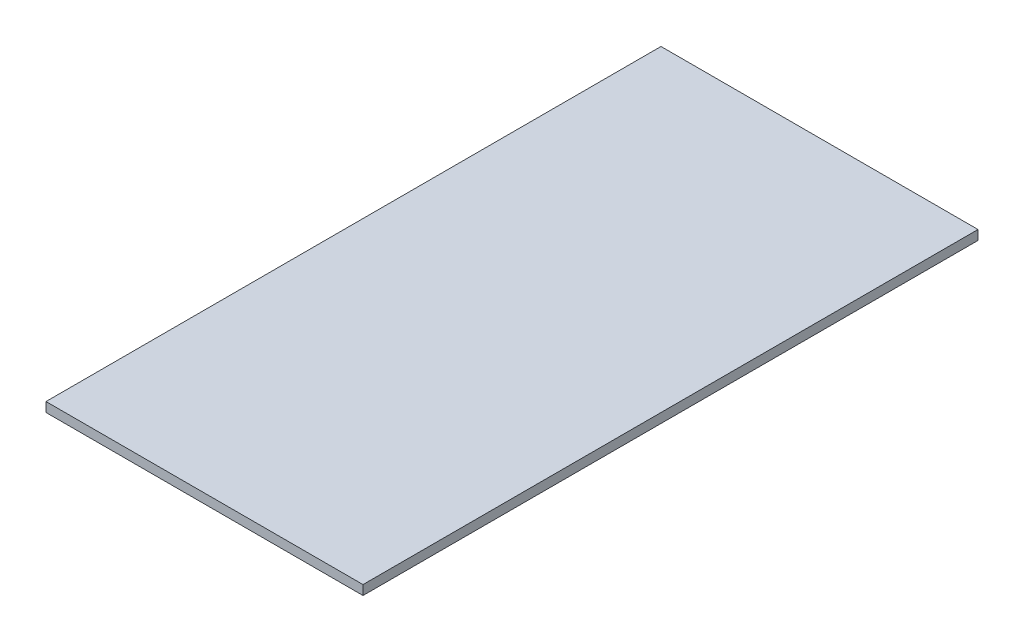
ISO-10303-21;
HEADER;
FILE_DESCRIPTION(('STEP AP214'),'2;1');
FILE_NAME('part.step','',(''),(''),'','','');
FILE_SCHEMA(('AUTOMOTIVE_DESIGN { 1 0 10303 214 1 1 1 1 }'));
ENDSEC;
DATA;
#1=APPLICATION_CONTEXT('core data for automotive mechanical design processes');
#2=APPLICATION_PROTOCOL_DEFINITION('international standard','automotive_design',2000,#1);
#3=PRODUCT_CONTEXT('',#1,'mechanical');
#4=PRODUCT('Part','Part','',(#3));
#5=PRODUCT_RELATED_PRODUCT_CATEGORY('part','',(#4));
#6=PRODUCT_DEFINITION_FORMATION('','',#4);
#7=PRODUCT_DEFINITION_CONTEXT('part definition',#1,'design');
#8=PRODUCT_DEFINITION('design','',#6,#7);
#9=PRODUCT_DEFINITION_SHAPE('','',#8);
#10=(LENGTH_UNIT() NAMED_UNIT(*) SI_UNIT(.MILLI.,.METRE.));
#11=(NAMED_UNIT(*) PLANE_ANGLE_UNIT() SI_UNIT($,.RADIAN.));
#12=(NAMED_UNIT(*) SI_UNIT($,.STERADIAN.) SOLID_ANGLE_UNIT());
#13=UNCERTAINTY_MEASURE_WITH_UNIT(LENGTH_MEASURE(1.E-05),#10,'distance_accuracy_value','');
#14=(GEOMETRIC_REPRESENTATION_CONTEXT(3) GLOBAL_UNCERTAINTY_ASSIGNED_CONTEXT((#13)) GLOBAL_UNIT_ASSIGNED_CONTEXT((#10,
#11,#12)) REPRESENTATION_CONTEXT('',''));
#15=CARTESIAN_POINT('',(0.,0.,0.));
#16=DIRECTION('',(0.,0.,1.));
#17=DIRECTION('',(1.,0.,0.));
#18=AXIS2_PLACEMENT_3D('',#15,#16,#17);
#19=CARTESIAN_POINT('',(0.,1.905,0.));
#20=DIRECTION('',(1.,0.,0.));
#21=DIRECTION('',(0.,0.,-1.));
#22=AXIS2_PLACEMENT_3D('',#19,#20,#21);
#23=PLANE('',#22);
#24=DIRECTION('',(0.,0.,1.));
#25=VECTOR('',#24,1.);
#26=CARTESIAN_POINT('',(0.,0.,0.));
#27=LINE('',#26,#25);
#28=CARTESIAN_POINT('',(0.,0.,-123.19));
#29=VERTEX_POINT('',#28);
#30=CARTESIAN_POINT('',(0.,0.,0.));
#31=VERTEX_POINT('',#30);
#32=EDGE_CURVE('E111',#29,#31,#27,.T.);
#33=ORIENTED_EDGE('',*,*,#32,.T.);
#34=DIRECTION('',(0.,-1.,0.));
#35=VECTOR('',#34,1.);
#36=CARTESIAN_POINT('',(0.,1.905,0.));
#37=LINE('',#36,#35);
#38=CARTESIAN_POINT('',(0.,1.905,0.));
#39=VERTEX_POINT('',#38);
#40=EDGE_CURVE('E11',#39,#31,#37,.T.);
#41=ORIENTED_EDGE('',*,*,#40,.F.);
#42=DIRECTION('',(0.,0.,1.));
#43=VECTOR('',#42,1.);
#44=CARTESIAN_POINT('',(0.,1.905,0.));
#45=LINE('',#44,#43);
#46=CARTESIAN_POINT('',(0.,1.905,-123.19));
#47=VERTEX_POINT('',#46);
#48=EDGE_CURVE('E95',#47,#39,#45,.T.);
#49=ORIENTED_EDGE('',*,*,#48,.F.);
#50=DIRECTION('',(0.,-1.,0.));
#51=VECTOR('',#50,1.);
#52=CARTESIAN_POINT('',(0.,1.905,-123.19));
#53=LINE('',#52,#51);
#54=EDGE_CURVE('E107',#47,#29,#53,.T.);
#55=ORIENTED_EDGE('',*,*,#54,.T.);
#56=EDGE_LOOP('',(#33,#41,#49,#55));
#57=FACE_BOUND('',#56,.T.);
#58=ADVANCED_FACE('F43',(#57),#23,.F.);
#59=CARTESIAN_POINT('',(0.,1.905,0.));
#60=DIRECTION('',(0.,0.,-1.));
#61=DIRECTION('',(-1.,0.,0.));
#62=AXIS2_PLACEMENT_3D('',#59,#60,#61);
#63=PLANE('',#62);
#64=DIRECTION('',(1.,0.,0.));
#65=VECTOR('',#64,1.);
#66=CARTESIAN_POINT('',(0.,0.,0.));
#67=LINE('',#66,#65);
#68=CARTESIAN_POINT('',(63.5,0.,0.));
#69=VERTEX_POINT('',#68);
#70=EDGE_CURVE('E100',#31,#69,#67,.T.);
#71=ORIENTED_EDGE('',*,*,#70,.T.);
#72=DIRECTION('',(0.,-1.,0.));
#73=VECTOR('',#72,1.);
#74=CARTESIAN_POINT('',(63.5,1.905,0.));
#75=LINE('',#74,#73);
#76=CARTESIAN_POINT('',(63.5,1.905,0.));
#77=VERTEX_POINT('',#76);
#78=EDGE_CURVE('E52',#77,#69,#75,.T.);
#79=ORIENTED_EDGE('',*,*,#78,.F.);
#80=DIRECTION('',(1.,0.,0.));
#81=VECTOR('',#80,1.);
#82=CARTESIAN_POINT('',(0.,1.905,0.));
#83=LINE('',#82,#81);
#84=EDGE_CURVE('E90',#39,#77,#83,.T.);
#85=ORIENTED_EDGE('',*,*,#84,.F.);
#86=ORIENTED_EDGE('',*,*,#40,.T.);
#87=EDGE_LOOP('',(#71,#79,#85,#86));
#88=FACE_BOUND('',#87,.T.);
#89=ADVANCED_FACE('F99',(#88),#63,.F.);
#90=CARTESIAN_POINT('',(63.5,1.905,0.));
#91=DIRECTION('',(-1.,0.,0.));
#92=DIRECTION('',(0.,0.,1.));
#93=AXIS2_PLACEMENT_3D('',#90,#91,#92);
#94=PLANE('',#93);
#95=DIRECTION('',(0.,0.,-1.));
#96=VECTOR('',#95,1.);
#97=CARTESIAN_POINT('',(63.5,0.,0.));
#98=LINE('',#97,#96);
#99=CARTESIAN_POINT('',(63.5,0.,-123.19));
#100=VERTEX_POINT('',#99);
#101=EDGE_CURVE('E77',#69,#100,#98,.T.);
#102=ORIENTED_EDGE('',*,*,#101,.T.);
#103=DIRECTION('',(0.,-1.,0.));
#104=VECTOR('',#103,1.);
#105=CARTESIAN_POINT('',(63.5,1.905,-123.19));
#106=LINE('',#105,#104);
#107=CARTESIAN_POINT('',(63.5,1.905,-123.19));
#108=VERTEX_POINT('',#107);
#109=EDGE_CURVE('E102',#108,#100,#106,.T.);
#110=ORIENTED_EDGE('',*,*,#109,.F.);
#111=DIRECTION('',(0.,0.,-1.));
#112=VECTOR('',#111,1.);
#113=CARTESIAN_POINT('',(63.5,1.905,0.));
#114=LINE('',#113,#112);
#115=EDGE_CURVE('E93',#77,#108,#114,.T.);
#116=ORIENTED_EDGE('',*,*,#115,.F.);
#117=ORIENTED_EDGE('',*,*,#78,.T.);
#118=EDGE_LOOP('',(#102,#110,#116,#117));
#119=FACE_BOUND('',#118,.T.);
#120=ADVANCED_FACE('F103',(#119),#94,.F.);
#121=CARTESIAN_POINT('',(0.,1.905,-123.19));
#122=DIRECTION('',(0.,0.,1.));
#123=DIRECTION('',(1.,0.,0.));
#124=AXIS2_PLACEMENT_3D('',#121,#122,#123);
#125=PLANE('',#124);
#126=DIRECTION('',(-1.,0.,0.));
#127=VECTOR('',#126,1.);
#128=CARTESIAN_POINT('',(0.,0.,-123.19));
#129=LINE('',#128,#127);
#130=EDGE_CURVE('E83',#100,#29,#129,.T.);
#131=ORIENTED_EDGE('',*,*,#130,.T.);
#132=ORIENTED_EDGE('',*,*,#54,.F.);
#133=DIRECTION('',(-1.,0.,0.));
#134=VECTOR('',#133,1.);
#135=CARTESIAN_POINT('',(0.,1.905,-123.19));
#136=LINE('',#135,#134);
#137=EDGE_CURVE('E60',#108,#47,#136,.T.);
#138=ORIENTED_EDGE('',*,*,#137,.F.);
#139=ORIENTED_EDGE('',*,*,#109,.T.);
#140=EDGE_LOOP('',(#131,#132,#138,#139));
#141=FACE_BOUND('',#140,.T.);
#142=ADVANCED_FACE('F124',(#141),#125,.F.);
#143=CARTESIAN_POINT('',(0.,1.905,0.));
#144=DIRECTION('',(0.,-1.,0.));
#145=DIRECTION('',(0.,0.,-1.));
#146=AXIS2_PLACEMENT_3D('',#143,#144,#145);
#147=PLANE('',#146);
#148=ORIENTED_EDGE('',*,*,#48,.T.);
#149=ORIENTED_EDGE('',*,*,#84,.T.);
#150=ORIENTED_EDGE('',*,*,#115,.T.);
#151=ORIENTED_EDGE('',*,*,#137,.T.);
#152=EDGE_LOOP('',(#148,#149,#150,#151));
#153=FACE_BOUND('',#152,.T.);
#154=ADVANCED_FACE('F91',(#153),#147,.F.);
#155=CARTESIAN_POINT('',(0.,0.,0.));
#156=DIRECTION('',(0.,-1.,0.));
#157=DIRECTION('',(0.,0.,-1.));
#158=AXIS2_PLACEMENT_3D('',#155,#156,#157);
#159=PLANE('',#158);
#160=ORIENTED_EDGE('',*,*,#32,.F.);
#161=ORIENTED_EDGE('',*,*,#130,.F.);
#162=ORIENTED_EDGE('',*,*,#101,.F.);
#163=ORIENTED_EDGE('',*,*,#70,.F.);
#164=EDGE_LOOP('',(#160,#161,#162,#163));
#165=FACE_BOUND('',#164,.T.);
#166=ADVANCED_FACE('F127',(#165),#159,.T.);
#167=CLOSED_SHELL('',(#58,#89,#120,#142,#154,#166));
#168=MANIFOLD_SOLID_BREP('B2',#167);
#169=ADVANCED_BREP_SHAPE_REPRESENTATION('',(#18,#168),#14);
#170=SHAPE_DEFINITION_REPRESENTATION(#9,#169);
ENDSEC;
END-ISO-10303-21;
